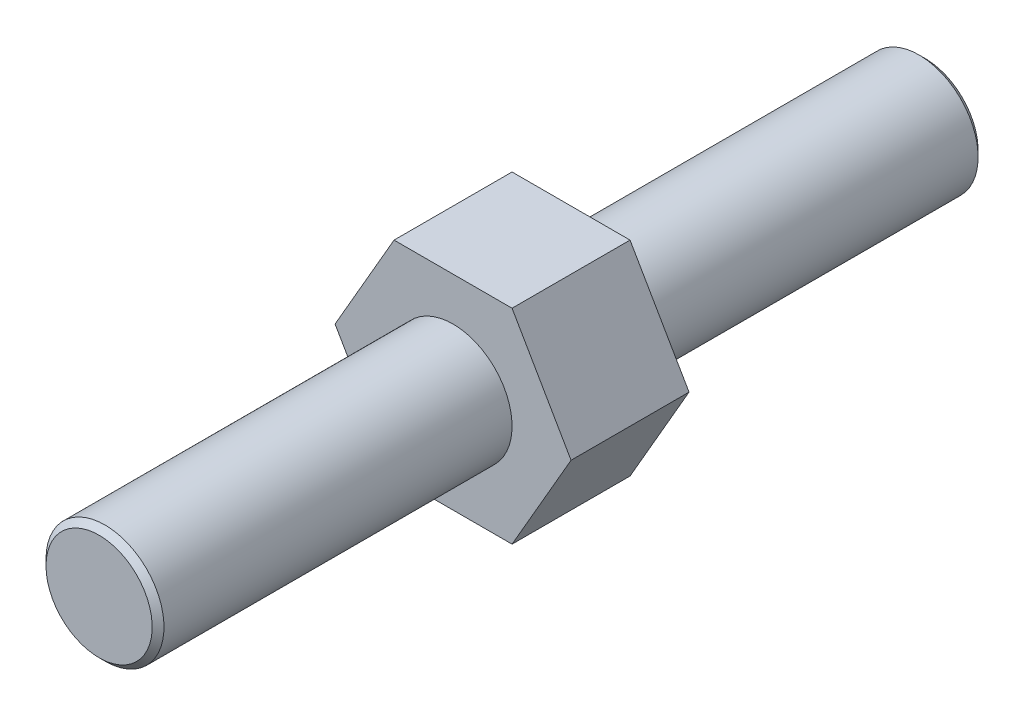
ISO-10303-21;
HEADER;
FILE_DESCRIPTION(('STEP AP214'),'2;1');
FILE_NAME('part.step','',(''),(''),'','','');
FILE_SCHEMA(('AUTOMOTIVE_DESIGN { 1 0 10303 214 1 1 1 1 }'));
ENDSEC;
DATA;
#1=APPLICATION_CONTEXT('core data for automotive mechanical design processes');
#2=APPLICATION_PROTOCOL_DEFINITION('international standard','automotive_design',2000,#1);
#3=PRODUCT_CONTEXT('',#1,'mechanical');
#4=PRODUCT('Part','Part','',(#3));
#5=PRODUCT_RELATED_PRODUCT_CATEGORY('part','',(#4));
#6=PRODUCT_DEFINITION_FORMATION('','',#4);
#7=PRODUCT_DEFINITION_CONTEXT('part definition',#1,'design');
#8=PRODUCT_DEFINITION('design','',#6,#7);
#9=PRODUCT_DEFINITION_SHAPE('','',#8);
#10=(LENGTH_UNIT() NAMED_UNIT(*) SI_UNIT(.MILLI.,.METRE.));
#11=(NAMED_UNIT(*) PLANE_ANGLE_UNIT() SI_UNIT($,.RADIAN.));
#12=(NAMED_UNIT(*) SI_UNIT($,.STERADIAN.) SOLID_ANGLE_UNIT());
#13=UNCERTAINTY_MEASURE_WITH_UNIT(LENGTH_MEASURE(1.E-05),#10,'distance_accuracy_value','');
#14=(GEOMETRIC_REPRESENTATION_CONTEXT(3) GLOBAL_UNCERTAINTY_ASSIGNED_CONTEXT((#13)) GLOBAL_UNIT_ASSIGNED_CONTEXT((#10,
#11,#12)) REPRESENTATION_CONTEXT('',''));
#15=CARTESIAN_POINT('',(0.,0.,0.));
#16=DIRECTION('',(0.,0.,1.));
#17=DIRECTION('',(1.,0.,0.));
#18=AXIS2_PLACEMENT_3D('',#15,#16,#17);
#19=CARTESIAN_POINT('',(0.,0.,-9.99999999999999));
#20=DIRECTION('',(0.,0.,1.));
#21=DIRECTION('',(-1.,0.,0.));
#22=AXIS2_PLACEMENT_3D('',#19,#20,#21);
#23=PLANE('',#22);
#24=DIRECTION('',(1.,0.,0.));
#25=VECTOR('',#24,1.);
#26=CARTESIAN_POINT('',(-10.0000000000003,17.3205080756887,-10.));
#27=LINE('',#26,#25);
#28=CARTESIAN_POINT('',(-10.0000000000003,17.3205080756887,-10.));
#29=VERTEX_POINT('',#28);
#30=CARTESIAN_POINT('',(9.99999999999974,17.3205080756887,-9.99999999999999));
#31=VERTEX_POINT('',#30);
#32=EDGE_CURVE('E107',#29,#31,#27,.T.);
#33=ORIENTED_EDGE('',*,*,#32,.T.);
#34=DIRECTION('',(0.500000000000018,-0.866025403784428,0.));
#35=VECTOR('',#34,1.);
#36=CARTESIAN_POINT('',(9.99999999999974,17.3205080756887,-9.99999999999999));
#37=LINE('',#36,#35);
#38=CARTESIAN_POINT('',(20.0000000000001,1.45716771982053E-13,-9.99999999999999));
#39=VERTEX_POINT('',#38);
#40=EDGE_CURVE('E128',#31,#39,#37,.T.);
#41=ORIENTED_EDGE('',*,*,#40,.T.);
#42=DIRECTION('',(-0.499999999999992,-0.866025403784443,0.));
#43=VECTOR('',#42,1.);
#44=CARTESIAN_POINT('',(20.0000000000001,1.45716771982053E-13,-9.99999999999999));
#45=LINE('',#44,#43);
#46=CARTESIAN_POINT('',(10.0000000000003,-17.3205080756887,-9.99999999999999));
#47=VERTEX_POINT('',#46);
#48=EDGE_CURVE('E125',#39,#47,#45,.T.);
#49=ORIENTED_EDGE('',*,*,#48,.T.);
#50=DIRECTION('',(-1.,0.,0.));
#51=VECTOR('',#50,1.);
#52=CARTESIAN_POINT('',(10.0000000000003,-17.3205080756887,-9.99999999999999));
#53=LINE('',#52,#51);
#54=CARTESIAN_POINT('',(-9.99999999999974,-17.3205080756887,-10.));
#55=VERTEX_POINT('',#54);
#56=EDGE_CURVE('E120',#47,#55,#53,.T.);
#57=ORIENTED_EDGE('',*,*,#56,.T.);
#58=DIRECTION('',(-0.500000000000018,0.866025403784429,0.));
#59=VECTOR('',#58,1.);
#60=CARTESIAN_POINT('',(-9.99999999999974,-17.3205080756887,-10.));
#61=LINE('',#60,#59);
#62=CARTESIAN_POINT('',(-20.0000000000001,-1.45716771982052E-13,-10.));
#63=VERTEX_POINT('',#62);
#64=EDGE_CURVE('E118',#55,#63,#61,.T.);
#65=ORIENTED_EDGE('',*,*,#64,.T.);
#66=DIRECTION('',(-0.499999999999992,-0.866025403784443,0.));
#67=VECTOR('',#66,1.);
#68=CARTESIAN_POINT('',(-10.0000000000003,17.3205080756887,-10.));
#69=LINE('',#68,#67);
#70=EDGE_CURVE('E103',#29,#63,#69,.T.);
#71=ORIENTED_EDGE('',*,*,#70,.F.);
#72=EDGE_LOOP('',(#33,#41,#49,#57,#65,#71));
#73=FACE_BOUND('',#72,.T.);
#74=CARTESIAN_POINT('',(0.,0.,-9.99999999999999));
#75=DIRECTION('',(0.,0.,1.));
#76=DIRECTION('',(1.,0.,0.));
#77=AXIS2_PLACEMENT_3D('',#74,#75,#76);
#78=CIRCLE('',#77,10.);
#79=CARTESIAN_POINT('',(10.,0.,-9.99999999999999));
#80=VERTEX_POINT('',#79);
#81=EDGE_CURVE('E13',#80,#80,#78,.F.);
#82=ORIENTED_EDGE('',*,*,#81,.F.);
#83=EDGE_LOOP('',(#82));
#84=FACE_BOUND('',#83,.T.);
#85=ADVANCED_FACE('F47',(#73,#84),#23,.F.);
#86=CARTESIAN_POINT('',(0.,0.,9.99999999999999));
#87=DIRECTION('',(0.,0.,-1.));
#88=DIRECTION('',(-1.,0.,0.));
#89=AXIS2_PLACEMENT_3D('',#86,#87,#88);
#90=PLANE('',#89);
#91=DIRECTION('',(1.,0.,0.));
#92=VECTOR('',#91,1.);
#93=CARTESIAN_POINT('',(-10.0000000000003,17.3205080756887,9.99999999999999));
#94=LINE('',#93,#92);
#95=CARTESIAN_POINT('',(-10.0000000000003,17.3205080756887,9.99999999999999));
#96=VERTEX_POINT('',#95);
#97=CARTESIAN_POINT('',(9.99999999999974,17.3205080756887,10.));
#98=VERTEX_POINT('',#97);
#99=EDGE_CURVE('E136',#96,#98,#94,.T.);
#100=ORIENTED_EDGE('',*,*,#99,.F.);
#101=DIRECTION('',(-0.499999999999992,-0.866025403784443,0.));
#102=VECTOR('',#101,1.);
#103=CARTESIAN_POINT('',(-10.0000000000003,17.3205080756887,9.99999999999999));
#104=LINE('',#103,#102);
#105=CARTESIAN_POINT('',(-20.0000000000001,-1.45716771982053E-13,9.99999999999999));
#106=VERTEX_POINT('',#105);
#107=EDGE_CURVE('E69',#96,#106,#104,.T.);
#108=ORIENTED_EDGE('',*,*,#107,.T.);
#109=DIRECTION('',(-0.500000000000018,0.866025403784429,0.));
#110=VECTOR('',#109,1.);
#111=CARTESIAN_POINT('',(-9.99999999999974,-17.3205080756887,9.99999999999999));
#112=LINE('',#111,#110);
#113=CARTESIAN_POINT('',(-9.99999999999974,-17.3205080756887,9.99999999999999));
#114=VERTEX_POINT('',#113);
#115=EDGE_CURVE('E147',#114,#106,#112,.T.);
#116=ORIENTED_EDGE('',*,*,#115,.F.);
#117=DIRECTION('',(-1.,0.,0.));
#118=VECTOR('',#117,1.);
#119=CARTESIAN_POINT('',(10.0000000000003,-17.3205080756887,10.));
#120=LINE('',#119,#118);
#121=CARTESIAN_POINT('',(10.0000000000003,-17.3205080756887,10.));
#122=VERTEX_POINT('',#121);
#123=EDGE_CURVE('E144',#122,#114,#120,.T.);
#124=ORIENTED_EDGE('',*,*,#123,.F.);
#125=DIRECTION('',(-0.499999999999992,-0.866025403784443,0.));
#126=VECTOR('',#125,1.);
#127=CARTESIAN_POINT('',(20.0000000000001,1.45716771982052E-13,10.));
#128=LINE('',#127,#126);
#129=CARTESIAN_POINT('',(20.0000000000001,1.45716771982052E-13,10.));
#130=VERTEX_POINT('',#129);
#131=EDGE_CURVE('E141',#130,#122,#128,.T.);
#132=ORIENTED_EDGE('',*,*,#131,.F.);
#133=DIRECTION('',(0.500000000000018,-0.866025403784428,0.));
#134=VECTOR('',#133,1.);
#135=CARTESIAN_POINT('',(9.99999999999974,17.3205080756887,10.));
#136=LINE('',#135,#134);
#137=EDGE_CURVE('E138',#98,#130,#136,.T.);
#138=ORIENTED_EDGE('',*,*,#137,.F.);
#139=EDGE_LOOP('',(#100,#108,#116,#124,#132,#138));
#140=FACE_BOUND('',#139,.T.);
#141=CARTESIAN_POINT('',(0.,0.,9.99999999999999));
#142=DIRECTION('',(0.,0.,-1.));
#143=DIRECTION('',(-1.,0.,0.));
#144=AXIS2_PLACEMENT_3D('',#141,#142,#143);
#145=CIRCLE('',#144,10.);
#146=CARTESIAN_POINT('',(-10.,0.,9.99999999999999));
#147=VERTEX_POINT('',#146);
#148=EDGE_CURVE('E55',#147,#147,#145,.F.);
#149=ORIENTED_EDGE('',*,*,#148,.F.);
#150=EDGE_LOOP('',(#149));
#151=FACE_BOUND('',#150,.T.);
#152=ADVANCED_FACE('F164',(#140,#151),#90,.F.);
#153=CARTESIAN_POINT('',(-10.0000000000003,17.3205080756887,9.99999999999999));
#154=DIRECTION('',(0.,1.,0.));
#155=DIRECTION('',(0.,0.,1.));
#156=AXIS2_PLACEMENT_3D('',#153,#154,#155);
#157=PLANE('',#156);
#158=DIRECTION('',(0.,0.,-1.));
#159=VECTOR('',#158,1.);
#160=CARTESIAN_POINT('',(9.99999999999974,17.3205080756887,10.));
#161=LINE('',#160,#159);
#162=EDGE_CURVE('E108',#98,#31,#161,.T.);
#163=ORIENTED_EDGE('',*,*,#162,.T.);
#164=ORIENTED_EDGE('',*,*,#32,.F.);
#165=DIRECTION('',(0.,0.,-1.));
#166=VECTOR('',#165,1.);
#167=CARTESIAN_POINT('',(-10.0000000000003,17.3205080756887,9.99999999999999));
#168=LINE('',#167,#166);
#169=EDGE_CURVE('E62',#96,#29,#168,.T.);
#170=ORIENTED_EDGE('',*,*,#169,.F.);
#171=ORIENTED_EDGE('',*,*,#99,.T.);
#172=EDGE_LOOP('',(#163,#164,#170,#171));
#173=FACE_BOUND('',#172,.T.);
#174=ADVANCED_FACE('F49',(#173),#157,.T.);
#175=CARTESIAN_POINT('',(-10.0000000000003,17.3205080756887,9.99999999999999));
#176=DIRECTION('',(0.866025403784443,-0.499999999999992,0.));
#177=DIRECTION('',(0.499999999999992,0.866025403784443,0.));
#178=AXIS2_PLACEMENT_3D('',#175,#176,#177);
#179=PLANE('',#178);
#180=ORIENTED_EDGE('',*,*,#169,.T.);
#181=ORIENTED_EDGE('',*,*,#70,.T.);
#182=DIRECTION('',(0.,0.,-1.));
#183=VECTOR('',#182,1.);
#184=CARTESIAN_POINT('',(-20.0000000000001,-1.45716771982053E-13,9.99999999999999));
#185=LINE('',#184,#183);
#186=EDGE_CURVE('E104',#106,#63,#185,.T.);
#187=ORIENTED_EDGE('',*,*,#186,.F.);
#188=ORIENTED_EDGE('',*,*,#107,.F.);
#189=EDGE_LOOP('',(#180,#181,#187,#188));
#190=FACE_BOUND('',#189,.T.);
#191=ADVANCED_FACE('F101',(#190),#179,.F.);
#192=CARTESIAN_POINT('',(-9.99999999999974,-17.3205080756887,9.99999999999999));
#193=DIRECTION('',(-0.866025403784429,-0.500000000000018,0.));
#194=DIRECTION('',(0.500000000000018,-0.866025403784429,0.));
#195=AXIS2_PLACEMENT_3D('',#192,#193,#194);
#196=PLANE('',#195);
#197=ORIENTED_EDGE('',*,*,#186,.T.);
#198=ORIENTED_EDGE('',*,*,#64,.F.);
#199=DIRECTION('',(0.,0.,-1.));
#200=VECTOR('',#199,1.);
#201=CARTESIAN_POINT('',(-9.99999999999974,-17.3205080756887,9.99999999999999));
#202=LINE('',#201,#200);
#203=EDGE_CURVE('E152',#114,#55,#202,.T.);
#204=ORIENTED_EDGE('',*,*,#203,.F.);
#205=ORIENTED_EDGE('',*,*,#115,.T.);
#206=EDGE_LOOP('',(#197,#198,#204,#205));
#207=FACE_BOUND('',#206,.T.);
#208=ADVANCED_FACE('F178',(#207),#196,.T.);
#209=CARTESIAN_POINT('',(10.0000000000003,-17.3205080756887,10.));
#210=DIRECTION('',(0.,-1.,0.));
#211=DIRECTION('',(1.,0.,0.));
#212=AXIS2_PLACEMENT_3D('',#209,#210,#211);
#213=PLANE('',#212);
#214=ORIENTED_EDGE('',*,*,#203,.T.);
#215=ORIENTED_EDGE('',*,*,#56,.F.);
#216=DIRECTION('',(0.,0.,-1.));
#217=VECTOR('',#216,1.);
#218=CARTESIAN_POINT('',(10.0000000000003,-17.3205080756887,10.));
#219=LINE('',#218,#217);
#220=EDGE_CURVE('E154',#122,#47,#219,.T.);
#221=ORIENTED_EDGE('',*,*,#220,.F.);
#222=ORIENTED_EDGE('',*,*,#123,.T.);
#223=EDGE_LOOP('',(#214,#215,#221,#222));
#224=FACE_BOUND('',#223,.T.);
#225=ADVANCED_FACE('F181',(#224),#213,.T.);
#226=CARTESIAN_POINT('',(20.0000000000001,1.45716771982052E-13,10.));
#227=DIRECTION('',(0.866025403784443,-0.499999999999992,0.));
#228=DIRECTION('',(0.499999999999992,0.866025403784443,0.));
#229=AXIS2_PLACEMENT_3D('',#226,#227,#228);
#230=PLANE('',#229);
#231=ORIENTED_EDGE('',*,*,#220,.T.);
#232=ORIENTED_EDGE('',*,*,#48,.F.);
#233=DIRECTION('',(0.,0.,-1.));
#234=VECTOR('',#233,1.);
#235=CARTESIAN_POINT('',(20.0000000000001,1.45716771982052E-13,10.));
#236=LINE('',#235,#234);
#237=EDGE_CURVE('E156',#130,#39,#236,.T.);
#238=ORIENTED_EDGE('',*,*,#237,.F.);
#239=ORIENTED_EDGE('',*,*,#131,.T.);
#240=EDGE_LOOP('',(#231,#232,#238,#239));
#241=FACE_BOUND('',#240,.T.);
#242=ADVANCED_FACE('F185',(#241),#230,.T.);
#243=CARTESIAN_POINT('',(9.99999999999974,17.3205080756887,10.));
#244=DIRECTION('',(0.866025403784428,0.500000000000018,0.));
#245=DIRECTION('',(-0.500000000000018,0.866025403784429,0.));
#246=AXIS2_PLACEMENT_3D('',#243,#244,#245);
#247=PLANE('',#246);
#248=ORIENTED_EDGE('',*,*,#237,.T.);
#249=ORIENTED_EDGE('',*,*,#40,.F.);
#250=ORIENTED_EDGE('',*,*,#162,.F.);
#251=ORIENTED_EDGE('',*,*,#137,.T.);
#252=EDGE_LOOP('',(#248,#249,#250,#251));
#253=FACE_BOUND('',#252,.T.);
#254=ADVANCED_FACE('F188',(#253),#247,.T.);
#255=CARTESIAN_POINT('',(0.,0.,70.));
#256=DIRECTION('',(0.,0.,-1.));
#257=DIRECTION('',(-1.,0.,0.));
#258=AXIS2_PLACEMENT_3D('',#255,#256,#257);
#259=PLANE('',#258);
#260=CARTESIAN_POINT('',(0.,0.,70.));
#261=DIRECTION('',(0.,0.,-1.));
#262=DIRECTION('',(-1.,0.,0.));
#263=AXIS2_PLACEMENT_3D('',#260,#261,#262);
#264=CIRCLE('',#263,9.);
#265=CARTESIAN_POINT('',(-8.99999999999999,0.,70.));
#266=VERTEX_POINT('',#265);
#267=EDGE_CURVE('E133',#266,#266,#264,.T.);
#268=ORIENTED_EDGE('',*,*,#267,.F.);
#269=EDGE_LOOP('',(#268));
#270=FACE_BOUND('',#269,.T.);
#271=ADVANCED_FACE('F174',(#270),#259,.F.);
#272=CARTESIAN_POINT('',(0.,0.,70.));
#273=DIRECTION('',(0.,0.,-1.));
#274=DIRECTION('',(-1.,0.,0.));
#275=AXIS2_PLACEMENT_3D('',#272,#273,#274);
#276=CONICAL_SURFACE('',#275,9.,0.785398163397447);
#277=CARTESIAN_POINT('',(0.,0.,69.));
#278=DIRECTION('',(0.,0.,-1.));
#279=DIRECTION('',(-1.,0.,0.));
#280=AXIS2_PLACEMENT_3D('',#277,#278,#279);
#281=CIRCLE('',#280,10.);
#282=CARTESIAN_POINT('',(-9.99999999999999,0.,69.));
#283=VERTEX_POINT('',#282);
#284=EDGE_CURVE('E130',#283,#283,#281,.T.);
#285=ORIENTED_EDGE('',*,*,#284,.F.);
#286=EDGE_LOOP('',(#285));
#287=FACE_BOUND('',#286,.T.);
#288=ORIENTED_EDGE('',*,*,#267,.T.);
#289=EDGE_LOOP('',(#288));
#290=FACE_BOUND('',#289,.T.);
#291=ADVANCED_FACE('F195',(#287,#290),#276,.T.);
#292=CARTESIAN_POINT('',(0.,0.,9.99999999999999));
#293=DIRECTION('',(0.,0.,-1.));
#294=DIRECTION('',(-1.,0.,0.));
#295=AXIS2_PLACEMENT_3D('',#292,#293,#294);
#296=CYLINDRICAL_SURFACE('',#295,10.);
#297=ORIENTED_EDGE('',*,*,#148,.T.);
#298=EDGE_LOOP('',(#297));
#299=FACE_BOUND('',#298,.T.);
#300=ORIENTED_EDGE('',*,*,#284,.T.);
#301=EDGE_LOOP('',(#300));
#302=FACE_BOUND('',#301,.T.);
#303=ADVANCED_FACE('F161',(#299,#302),#296,.T.);
#304=CARTESIAN_POINT('',(0.,0.,-70.));
#305=DIRECTION('',(0.,0.,1.));
#306=DIRECTION('',(-1.,0.,0.));
#307=AXIS2_PLACEMENT_3D('',#304,#305,#306);
#308=PLANE('',#307);
#309=CARTESIAN_POINT('',(0.,0.,-70.));
#310=DIRECTION('',(0.,0.,-1.));
#311=DIRECTION('',(-1.,0.,0.));
#312=AXIS2_PLACEMENT_3D('',#309,#310,#311);
#313=CIRCLE('',#312,9.);
#314=CARTESIAN_POINT('',(-8.99999999999999,0.,-70.));
#315=VERTEX_POINT('',#314);
#316=EDGE_CURVE('E112',#315,#315,#313,.T.);
#317=ORIENTED_EDGE('',*,*,#316,.T.);
#318=EDGE_LOOP('',(#317));
#319=FACE_BOUND('',#318,.T.);
#320=ADVANCED_FACE('F211',(#319),#308,.F.);
#321=CARTESIAN_POINT('',(0.,0.,-70.));
#322=DIRECTION('',(0.,0.,1.));
#323=DIRECTION('',(-1.,0.,0.));
#324=AXIS2_PLACEMENT_3D('',#321,#322,#323);
#325=CONICAL_SURFACE('',#324,9.,0.785398163397447);
#326=CARTESIAN_POINT('',(0.,0.,-69.));
#327=DIRECTION('',(0.,0.,-1.));
#328=DIRECTION('',(-1.,0.,0.));
#329=AXIS2_PLACEMENT_3D('',#326,#327,#328);
#330=CIRCLE('',#329,10.);
#331=CARTESIAN_POINT('',(-9.99999999999999,0.,-69.));
#332=VERTEX_POINT('',#331);
#333=EDGE_CURVE('E231',#332,#332,#330,.T.);
#334=ORIENTED_EDGE('',*,*,#333,.T.);
#335=EDGE_LOOP('',(#334));
#336=FACE_BOUND('',#335,.T.);
#337=ORIENTED_EDGE('',*,*,#316,.F.);
#338=EDGE_LOOP('',(#337));
#339=FACE_BOUND('',#338,.T.);
#340=ADVANCED_FACE('F217',(#336,#339),#325,.T.);
#341=CARTESIAN_POINT('',(0.,0.,-9.99999999999999));
#342=DIRECTION('',(0.,0.,1.));
#343=DIRECTION('',(-1.,0.,0.));
#344=AXIS2_PLACEMENT_3D('',#341,#342,#343);
#345=CYLINDRICAL_SURFACE('',#344,10.);
#346=ORIENTED_EDGE('',*,*,#81,.T.);
#347=EDGE_LOOP('',(#346));
#348=FACE_BOUND('',#347,.T.);
#349=ORIENTED_EDGE('',*,*,#333,.F.);
#350=EDGE_LOOP('',(#349));
#351=FACE_BOUND('',#350,.T.);
#352=ADVANCED_FACE('F221',(#348,#351),#345,.T.);
#353=CLOSED_SHELL('',(#85,#152,#174,#191,#208,#225,#242,#254,#271,#291,#303,#320,#340,#352));
#354=MANIFOLD_SOLID_BREP('B2',#353);
#355=ADVANCED_BREP_SHAPE_REPRESENTATION('',(#18,#354),#14);
#356=SHAPE_DEFINITION_REPRESENTATION(#9,#355);
ENDSEC;
END-ISO-10303-21;
